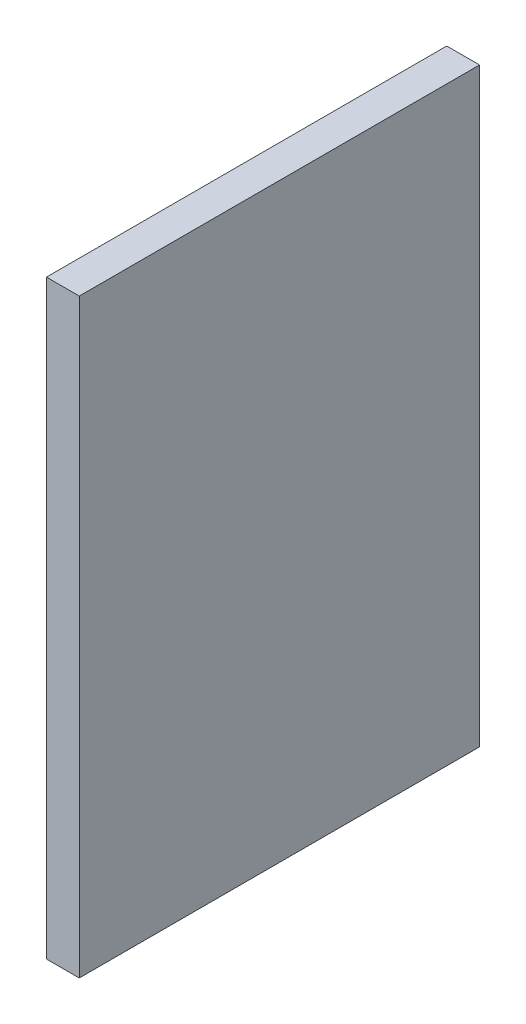
ISO-10303-21;
HEADER;
FILE_DESCRIPTION(('STEP AP214'),'2;1');
FILE_NAME('part.step','',(''),(''),'','','');
FILE_SCHEMA(('AUTOMOTIVE_DESIGN { 1 0 10303 214 1 1 1 1 }'));
ENDSEC;
DATA;
#1=APPLICATION_CONTEXT('core data for automotive mechanical design processes');
#2=APPLICATION_PROTOCOL_DEFINITION('international standard','automotive_design',2000,#1);
#3=PRODUCT_CONTEXT('',#1,'mechanical');
#4=PRODUCT('Part','Part','',(#3));
#5=PRODUCT_RELATED_PRODUCT_CATEGORY('part','',(#4));
#6=PRODUCT_DEFINITION_FORMATION('','',#4);
#7=PRODUCT_DEFINITION_CONTEXT('part definition',#1,'design');
#8=PRODUCT_DEFINITION('design','',#6,#7);
#9=PRODUCT_DEFINITION_SHAPE('','',#8);
#10=(LENGTH_UNIT() NAMED_UNIT(*) SI_UNIT(.MILLI.,.METRE.));
#11=(NAMED_UNIT(*) PLANE_ANGLE_UNIT() SI_UNIT($,.RADIAN.));
#12=(NAMED_UNIT(*) SI_UNIT($,.STERADIAN.) SOLID_ANGLE_UNIT());
#13=UNCERTAINTY_MEASURE_WITH_UNIT(LENGTH_MEASURE(1.E-05),#10,'distance_accuracy_value','');
#14=(GEOMETRIC_REPRESENTATION_CONTEXT(3) GLOBAL_UNCERTAINTY_ASSIGNED_CONTEXT((#13)) GLOBAL_UNIT_ASSIGNED_CONTEXT((#10,
#11,#12)) REPRESENTATION_CONTEXT('',''));
#15=CARTESIAN_POINT('',(0.,0.,0.));
#16=DIRECTION('',(0.,0.,1.));
#17=DIRECTION('',(1.,0.,0.));
#18=AXIS2_PLACEMENT_3D('',#15,#16,#17);
#19=CARTESIAN_POINT('',(6.35,0.,0.));
#20=DIRECTION('',(0.,0.,-1.));
#21=DIRECTION('',(-1.,0.,0.));
#22=AXIS2_PLACEMENT_3D('',#19,#20,#21);
#23=PLANE('',#22);
#24=DIRECTION('',(0.,-1.,0.));
#25=VECTOR('',#24,1.);
#26=CARTESIAN_POINT('',(0.,0.,0.));
#27=LINE('',#26,#25);
#28=CARTESIAN_POINT('',(0.,114.3,0.));
#29=VERTEX_POINT('',#28);
#30=CARTESIAN_POINT('',(0.,0.,0.));
#31=VERTEX_POINT('',#30);
#32=EDGE_CURVE('E95',#29,#31,#27,.T.);
#33=ORIENTED_EDGE('',*,*,#32,.T.);
#34=DIRECTION('',(-1.,0.,0.));
#35=VECTOR('',#34,1.);
#36=CARTESIAN_POINT('',(6.35,0.,0.));
#37=LINE('',#36,#35);
#38=CARTESIAN_POINT('',(6.35,0.,0.));
#39=VERTEX_POINT('',#38);
#40=EDGE_CURVE('E11',#39,#31,#37,.T.);
#41=ORIENTED_EDGE('',*,*,#40,.F.);
#42=DIRECTION('',(0.,-1.,0.));
#43=VECTOR('',#42,1.);
#44=CARTESIAN_POINT('',(6.35,0.,0.));
#45=LINE('',#44,#43);
#46=CARTESIAN_POINT('',(6.35,114.3,0.));
#47=VERTEX_POINT('',#46);
#48=EDGE_CURVE('E83',#47,#39,#45,.T.);
#49=ORIENTED_EDGE('',*,*,#48,.F.);
#50=DIRECTION('',(-1.,0.,0.));
#51=VECTOR('',#50,1.);
#52=CARTESIAN_POINT('',(6.35,114.3,0.));
#53=LINE('',#52,#51);
#54=EDGE_CURVE('E91',#47,#29,#53,.T.);
#55=ORIENTED_EDGE('',*,*,#54,.T.);
#56=EDGE_LOOP('',(#33,#41,#49,#55));
#57=FACE_BOUND('',#56,.T.);
#58=ADVANCED_FACE('F32',(#57),#23,.F.);
#59=CARTESIAN_POINT('',(6.35,0.,0.));
#60=DIRECTION('',(0.,1.,0.));
#61=DIRECTION('',(0.,0.,1.));
#62=AXIS2_PLACEMENT_3D('',#59,#60,#61);
#63=PLANE('',#62);
#64=DIRECTION('',(0.,0.,-1.));
#65=VECTOR('',#64,1.);
#66=CARTESIAN_POINT('',(0.,0.,0.));
#67=LINE('',#66,#65);
#68=CARTESIAN_POINT('',(0.,0.,-77.47));
#69=VERTEX_POINT('',#68);
#70=EDGE_CURVE('E87',#31,#69,#67,.T.);
#71=ORIENTED_EDGE('',*,*,#70,.T.);
#72=DIRECTION('',(-1.,0.,0.));
#73=VECTOR('',#72,1.);
#74=CARTESIAN_POINT('',(6.35,0.,-77.47));
#75=LINE('',#74,#73);
#76=CARTESIAN_POINT('',(6.35,0.,-77.47));
#77=VERTEX_POINT('',#76);
#78=EDGE_CURVE('E40',#77,#69,#75,.T.);
#79=ORIENTED_EDGE('',*,*,#78,.F.);
#80=DIRECTION('',(0.,0.,-1.));
#81=VECTOR('',#80,1.);
#82=CARTESIAN_POINT('',(6.35,0.,0.));
#83=LINE('',#82,#81);
#84=EDGE_CURVE('E78',#39,#77,#83,.T.);
#85=ORIENTED_EDGE('',*,*,#84,.F.);
#86=ORIENTED_EDGE('',*,*,#40,.T.);
#87=EDGE_LOOP('',(#71,#79,#85,#86));
#88=FACE_BOUND('',#87,.T.);
#89=ADVANCED_FACE('F86',(#88),#63,.F.);
#90=CARTESIAN_POINT('',(6.35,0.,-77.47));
#91=DIRECTION('',(0.,0.,1.));
#92=DIRECTION('',(1.,0.,0.));
#93=AXIS2_PLACEMENT_3D('',#90,#91,#92);
#94=PLANE('',#93);
#95=DIRECTION('',(0.,1.,0.));
#96=VECTOR('',#95,1.);
#97=CARTESIAN_POINT('',(0.,0.,-77.47));
#98=LINE('',#97,#96);
#99=CARTESIAN_POINT('',(0.,114.3,-77.47));
#100=VERTEX_POINT('',#99);
#101=EDGE_CURVE('E65',#69,#100,#98,.T.);
#102=ORIENTED_EDGE('',*,*,#101,.T.);
#103=DIRECTION('',(-1.,0.,0.));
#104=VECTOR('',#103,1.);
#105=CARTESIAN_POINT('',(6.35,114.3,-77.47));
#106=LINE('',#105,#104);
#107=CARTESIAN_POINT('',(6.35,114.3,-77.47));
#108=VERTEX_POINT('',#107);
#109=EDGE_CURVE('E88',#108,#100,#106,.T.);
#110=ORIENTED_EDGE('',*,*,#109,.F.);
#111=DIRECTION('',(0.,1.,0.));
#112=VECTOR('',#111,1.);
#113=CARTESIAN_POINT('',(6.35,0.,-77.47));
#114=LINE('',#113,#112);
#115=EDGE_CURVE('E81',#77,#108,#114,.T.);
#116=ORIENTED_EDGE('',*,*,#115,.F.);
#117=ORIENTED_EDGE('',*,*,#78,.T.);
#118=EDGE_LOOP('',(#102,#110,#116,#117));
#119=FACE_BOUND('',#118,.T.);
#120=ADVANCED_FACE('F89',(#119),#94,.F.);
#121=CARTESIAN_POINT('',(6.35,114.3,0.));
#122=DIRECTION('',(0.,-1.,0.));
#123=DIRECTION('',(0.,0.,-1.));
#124=AXIS2_PLACEMENT_3D('',#121,#122,#123);
#125=PLANE('',#124);
#126=DIRECTION('',(0.,0.,1.));
#127=VECTOR('',#126,1.);
#128=CARTESIAN_POINT('',(0.,114.3,0.));
#129=LINE('',#128,#127);
#130=EDGE_CURVE('E71',#100,#29,#129,.T.);
#131=ORIENTED_EDGE('',*,*,#130,.T.);
#132=ORIENTED_EDGE('',*,*,#54,.F.);
#133=DIRECTION('',(0.,0.,1.));
#134=VECTOR('',#133,1.);
#135=CARTESIAN_POINT('',(6.35,114.3,0.));
#136=LINE('',#135,#134);
#137=EDGE_CURVE('E48',#108,#47,#136,.T.);
#138=ORIENTED_EDGE('',*,*,#137,.F.);
#139=ORIENTED_EDGE('',*,*,#109,.T.);
#140=EDGE_LOOP('',(#131,#132,#138,#139));
#141=FACE_BOUND('',#140,.T.);
#142=ADVANCED_FACE('F102',(#141),#125,.F.);
#143=CARTESIAN_POINT('',(6.35,0.,0.));
#144=DIRECTION('',(-1.,0.,0.));
#145=DIRECTION('',(0.,0.,1.));
#146=AXIS2_PLACEMENT_3D('',#143,#144,#145);
#147=PLANE('',#146);
#148=ORIENTED_EDGE('',*,*,#48,.T.);
#149=ORIENTED_EDGE('',*,*,#84,.T.);
#150=ORIENTED_EDGE('',*,*,#115,.T.);
#151=ORIENTED_EDGE('',*,*,#137,.T.);
#152=EDGE_LOOP('',(#148,#149,#150,#151));
#153=FACE_BOUND('',#152,.T.);
#154=ADVANCED_FACE('F79',(#153),#147,.F.);
#155=CARTESIAN_POINT('',(0.,0.,0.));
#156=DIRECTION('',(-1.,0.,0.));
#157=DIRECTION('',(0.,0.,1.));
#158=AXIS2_PLACEMENT_3D('',#155,#156,#157);
#159=PLANE('',#158);
#160=ORIENTED_EDGE('',*,*,#32,.F.);
#161=ORIENTED_EDGE('',*,*,#130,.F.);
#162=ORIENTED_EDGE('',*,*,#101,.F.);
#163=ORIENTED_EDGE('',*,*,#70,.F.);
#164=EDGE_LOOP('',(#160,#161,#162,#163));
#165=FACE_BOUND('',#164,.T.);
#166=ADVANCED_FACE('F105',(#165),#159,.T.);
#167=CLOSED_SHELL('',(#58,#89,#120,#142,#154,#166));
#168=MANIFOLD_SOLID_BREP('B2',#167);
#169=ADVANCED_BREP_SHAPE_REPRESENTATION('',(#18,#168),#14);
#170=SHAPE_DEFINITION_REPRESENTATION(#9,#169);
ENDSEC;
END-ISO-10303-21;
